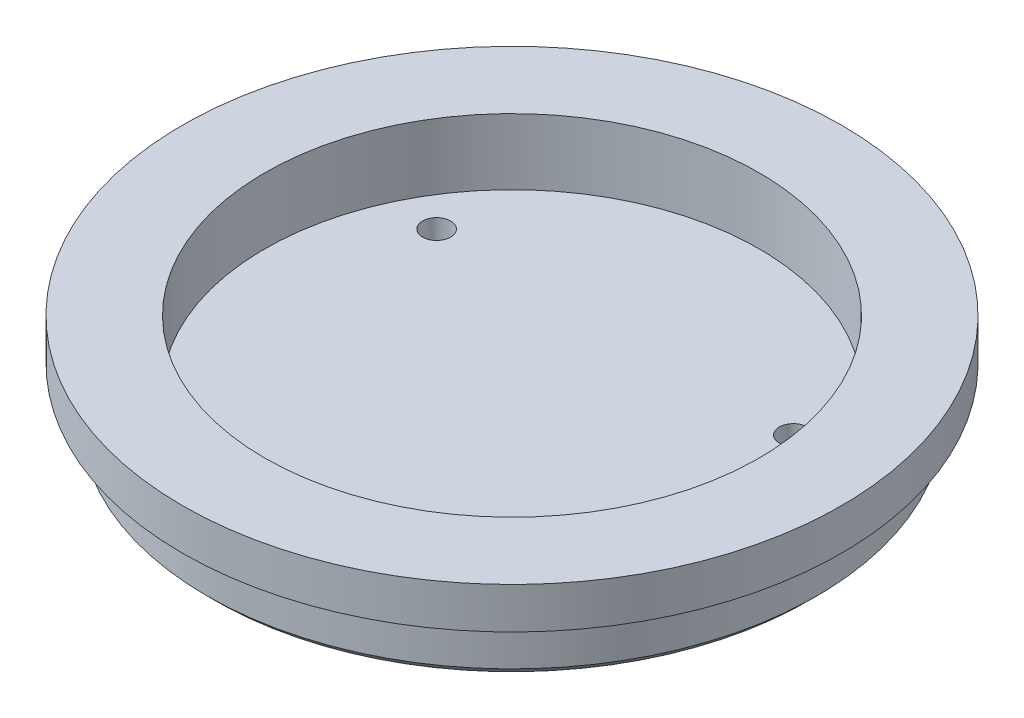
ISO-10303-21;
HEADER;
FILE_DESCRIPTION(('STEP AP214'),'2;1');
FILE_NAME('part.step','',(''),(''),'','','');
FILE_SCHEMA(('AUTOMOTIVE_DESIGN { 1 0 10303 214 1 1 1 1 }'));
ENDSEC;
DATA;
#1=APPLICATION_CONTEXT('core data for automotive mechanical design processes');
#2=APPLICATION_PROTOCOL_DEFINITION('international standard','automotive_design',2000,#1);
#3=PRODUCT_CONTEXT('',#1,'mechanical');
#4=PRODUCT('Part','Part','',(#3));
#5=PRODUCT_RELATED_PRODUCT_CATEGORY('part','',(#4));
#6=PRODUCT_DEFINITION_FORMATION('','',#4);
#7=PRODUCT_DEFINITION_CONTEXT('part definition',#1,'design');
#8=PRODUCT_DEFINITION('design','',#6,#7);
#9=PRODUCT_DEFINITION_SHAPE('','',#8);
#10=(LENGTH_UNIT() NAMED_UNIT(*) SI_UNIT(.MILLI.,.METRE.));
#11=(NAMED_UNIT(*) PLANE_ANGLE_UNIT() SI_UNIT($,.RADIAN.));
#12=(NAMED_UNIT(*) SI_UNIT($,.STERADIAN.) SOLID_ANGLE_UNIT());
#13=UNCERTAINTY_MEASURE_WITH_UNIT(LENGTH_MEASURE(1.E-05),#10,'distance_accuracy_value','');
#14=(GEOMETRIC_REPRESENTATION_CONTEXT(3) GLOBAL_UNCERTAINTY_ASSIGNED_CONTEXT((#13)) GLOBAL_UNIT_ASSIGNED_CONTEXT((#10,
#11,#12)) REPRESENTATION_CONTEXT('',''));
#15=CARTESIAN_POINT('',(0.,0.,0.));
#16=DIRECTION('',(0.,0.,1.));
#17=DIRECTION('',(1.,0.,0.));
#18=AXIS2_PLACEMENT_3D('',#15,#16,#17);
#19=CARTESIAN_POINT('',(-21.6506350946111,12.,-12.4999999999998));
#20=DIRECTION('',(0.,1.,0.));
#21=DIRECTION('',(0.,0.,1.));
#22=AXIS2_PLACEMENT_3D('',#19,#20,#21);
#23=CYLINDRICAL_SURFACE('',#22,1.69999999999999);
#24=CARTESIAN_POINT('',(-21.6506350946111,0.,-12.4999999999998));
#25=DIRECTION('',(0.,1.,0.));
#26=DIRECTION('',(0.,0.,1.));
#27=AXIS2_PLACEMENT_3D('',#24,#25,#26);
#28=CIRCLE('',#27,1.69999999999999);
#29=CARTESIAN_POINT('',(-21.6506350946111,0.,-10.7999999999998));
#30=VERTEX_POINT('',#29);
#31=EDGE_CURVE('E63',#30,#30,#28,.T.);
#32=ORIENTED_EDGE('',*,*,#31,.F.);
#33=EDGE_LOOP('',(#32));
#34=FACE_BOUND('',#33,.T.);
#35=CARTESIAN_POINT('',(-21.6506350946111,4.,-12.4999999999998));
#36=DIRECTION('',(0.,1.,0.));
#37=DIRECTION('',(0.,0.,1.));
#38=AXIS2_PLACEMENT_3D('',#35,#36,#37);
#39=CIRCLE('',#38,1.69999999999999);
#40=CARTESIAN_POINT('',(-21.6506350946111,4.,-10.7999999999998));
#41=VERTEX_POINT('',#40);
#42=EDGE_CURVE('E72',#41,#41,#39,.F.);
#43=ORIENTED_EDGE('',*,*,#42,.F.);
#44=EDGE_LOOP('',(#43));
#45=FACE_BOUND('',#44,.T.);
#46=ADVANCED_FACE('F34',(#34,#45),#23,.F.);
#47=CARTESIAN_POINT('',(21.6506350946109,12.,-12.5000000000001));
#48=DIRECTION('',(0.,1.,0.));
#49=DIRECTION('',(0.,0.,1.));
#50=AXIS2_PLACEMENT_3D('',#47,#48,#49);
#51=CYLINDRICAL_SURFACE('',#50,1.69999999999999);
#52=CARTESIAN_POINT('',(21.6506350946109,0.,-12.5000000000001));
#53=DIRECTION('',(0.,1.,0.));
#54=DIRECTION('',(0.,0.,1.));
#55=AXIS2_PLACEMENT_3D('',#52,#53,#54);
#56=CIRCLE('',#55,1.69999999999999);
#57=CARTESIAN_POINT('',(21.6506350946109,0.,-10.8000000000001));
#58=VERTEX_POINT('',#57);
#59=EDGE_CURVE('E66',#58,#58,#56,.T.);
#60=ORIENTED_EDGE('',*,*,#59,.F.);
#61=EDGE_LOOP('',(#60));
#62=FACE_BOUND('',#61,.T.);
#63=CARTESIAN_POINT('',(21.6506350946109,4.,-12.5000000000001));
#64=DIRECTION('',(0.,1.,0.));
#65=DIRECTION('',(0.,0.,1.));
#66=AXIS2_PLACEMENT_3D('',#63,#64,#65);
#67=CIRCLE('',#66,1.69999999999999);
#68=CARTESIAN_POINT('',(21.6506350946109,4.,-10.8000000000001));
#69=VERTEX_POINT('',#68);
#70=EDGE_CURVE('E76',#69,#69,#67,.F.);
#71=ORIENTED_EDGE('',*,*,#70,.F.);
#72=EDGE_LOOP('',(#71));
#73=FACE_BOUND('',#72,.T.);
#74=ADVANCED_FACE('F96',(#62,#73),#51,.F.);
#75=CARTESIAN_POINT('',(0.,12.,25.));
#76=DIRECTION('',(0.,1.,0.));
#77=DIRECTION('',(0.,0.,1.));
#78=AXIS2_PLACEMENT_3D('',#75,#76,#77);
#79=CYLINDRICAL_SURFACE('',#78,1.69999999999999);
#80=CARTESIAN_POINT('',(0.,0.,25.));
#81=DIRECTION('',(0.,1.,0.));
#82=DIRECTION('',(0.,0.,1.));
#83=AXIS2_PLACEMENT_3D('',#80,#81,#82);
#84=CIRCLE('',#83,1.69999999999999);
#85=CARTESIAN_POINT('',(0.,0.,26.7));
#86=VERTEX_POINT('',#85);
#87=EDGE_CURVE('E69',#86,#86,#84,.T.);
#88=ORIENTED_EDGE('',*,*,#87,.F.);
#89=EDGE_LOOP('',(#88));
#90=FACE_BOUND('',#89,.T.);
#91=CARTESIAN_POINT('',(0.,4.,25.));
#92=DIRECTION('',(0.,1.,0.));
#93=DIRECTION('',(0.,0.,1.));
#94=AXIS2_PLACEMENT_3D('',#91,#92,#93);
#95=CIRCLE('',#94,1.69999999999999);
#96=CARTESIAN_POINT('',(0.,4.,26.7));
#97=VERTEX_POINT('',#96);
#98=EDGE_CURVE('E38',#97,#97,#95,.F.);
#99=ORIENTED_EDGE('',*,*,#98,.F.);
#100=EDGE_LOOP('',(#99));
#101=FACE_BOUND('',#100,.T.);
#102=ADVANCED_FACE('F93',(#90,#101),#79,.F.);
#103=CARTESIAN_POINT('',(0.,0.,0.));
#104=DIRECTION('',(0.,-1.,0.));
#105=DIRECTION('',(0.,0.,-1.));
#106=AXIS2_PLACEMENT_3D('',#103,#104,#105);
#107=PLANE('',#106);
#108=ORIENTED_EDGE('',*,*,#87,.T.);
#109=EDGE_LOOP('',(#108));
#110=FACE_BOUND('',#109,.T.);
#111=ORIENTED_EDGE('',*,*,#59,.T.);
#112=EDGE_LOOP('',(#111));
#113=FACE_BOUND('',#112,.T.);
#114=ORIENTED_EDGE('',*,*,#31,.T.);
#115=EDGE_LOOP('',(#114));
#116=FACE_BOUND('',#115,.T.);
#117=CARTESIAN_POINT('',(0.,0.,0.));
#118=DIRECTION('',(0.,-1.,0.));
#119=DIRECTION('',(0.,0.,-1.));
#120=AXIS2_PLACEMENT_3D('',#117,#118,#119);
#121=CIRCLE('',#120,36.);
#122=CARTESIAN_POINT('',(0.,0.,-36.));
#123=VERTEX_POINT('',#122);
#124=EDGE_CURVE('E43',#123,#123,#121,.T.);
#125=ORIENTED_EDGE('',*,*,#124,.T.);
#126=EDGE_LOOP('',(#125));
#127=FACE_BOUND('',#126,.T.);
#128=ADVANCED_FACE('F95',(#110,#113,#116,#127),#107,.T.);
#129=CARTESIAN_POINT('',(0.,0.,0.));
#130=DIRECTION('',(0.,-1.,0.));
#131=DIRECTION('',(0.,0.,-1.));
#132=AXIS2_PLACEMENT_3D('',#129,#130,#131);
#133=CYLINDRICAL_SURFACE('',#132,37.);
#134=CARTESIAN_POINT('',(0.,1.,0.));
#135=DIRECTION('',(0.,-1.,0.));
#136=DIRECTION('',(0.,0.,-1.));
#137=AXIS2_PLACEMENT_3D('',#134,#135,#136);
#138=CIRCLE('',#137,37.);
#139=CARTESIAN_POINT('',(0.,1.,-37.));
#140=VERTEX_POINT('',#139);
#141=EDGE_CURVE('E10',#140,#140,#138,.F.);
#142=ORIENTED_EDGE('',*,*,#141,.T.);
#143=EDGE_LOOP('',(#142));
#144=FACE_BOUND('',#143,.T.);
#145=CARTESIAN_POINT('',(0.,7.,0.));
#146=DIRECTION('',(0.,-1.,0.));
#147=DIRECTION('',(0.,0.,-1.));
#148=AXIS2_PLACEMENT_3D('',#145,#146,#147);
#149=CIRCLE('',#148,37.);
#150=CARTESIAN_POINT('',(0.,7.,-37.));
#151=VERTEX_POINT('',#150);
#152=EDGE_CURVE('E49',#151,#151,#149,.T.);
#153=ORIENTED_EDGE('',*,*,#152,.T.);
#154=EDGE_LOOP('',(#153));
#155=FACE_BOUND('',#154,.T.);
#156=ADVANCED_FACE('F103',(#144,#155),#133,.T.);
#157=CARTESIAN_POINT('',(0.,7.,-37.));
#158=DIRECTION('',(0.,-1.,0.));
#159=DIRECTION('',(0.,0.,-1.));
#160=AXIS2_PLACEMENT_3D('',#157,#158,#159);
#161=PLANE('',#160);
#162=CARTESIAN_POINT('',(0.,7.,0.));
#163=DIRECTION('',(0.,-1.,0.));
#164=DIRECTION('',(0.,0.,-1.));
#165=AXIS2_PLACEMENT_3D('',#162,#163,#164);
#166=CIRCLE('',#165,40.);
#167=CARTESIAN_POINT('',(0.,7.,-40.));
#168=VERTEX_POINT('',#167);
#169=EDGE_CURVE('E55',#168,#168,#166,.T.);
#170=ORIENTED_EDGE('',*,*,#169,.T.);
#171=EDGE_LOOP('',(#170));
#172=FACE_BOUND('',#171,.T.);
#173=ORIENTED_EDGE('',*,*,#152,.F.);
#174=EDGE_LOOP('',(#173));
#175=FACE_BOUND('',#174,.T.);
#176=ADVANCED_FACE('F124',(#172,#175),#161,.T.);
#177=CARTESIAN_POINT('',(0.,0.,0.));
#178=DIRECTION('',(0.,-1.,0.));
#179=DIRECTION('',(0.,0.,-1.));
#180=AXIS2_PLACEMENT_3D('',#177,#178,#179);
#181=CYLINDRICAL_SURFACE('',#180,40.);
#182=CARTESIAN_POINT('',(0.,12.,0.));
#183=DIRECTION('',(0.,-1.,0.));
#184=DIRECTION('',(0.,0.,-1.));
#185=AXIS2_PLACEMENT_3D('',#182,#183,#184);
#186=CIRCLE('',#185,40.);
#187=CARTESIAN_POINT('',(0.,12.,-40.));
#188=VERTEX_POINT('',#187);
#189=EDGE_CURVE('E59',#188,#188,#186,.T.);
#190=ORIENTED_EDGE('',*,*,#189,.T.);
#191=EDGE_LOOP('',(#190));
#192=FACE_BOUND('',#191,.T.);
#193=ORIENTED_EDGE('',*,*,#169,.F.);
#194=EDGE_LOOP('',(#193));
#195=FACE_BOUND('',#194,.T.);
#196=ADVANCED_FACE('F120',(#192,#195),#181,.T.);
#197=CARTESIAN_POINT('',(0.,12.,-40.));
#198=DIRECTION('',(0.,1.,0.));
#199=DIRECTION('',(0.,0.,1.));
#200=AXIS2_PLACEMENT_3D('',#197,#198,#199);
#201=PLANE('',#200);
#202=CARTESIAN_POINT('',(0.,12.,0.));
#203=DIRECTION('',(0.,1.,0.));
#204=DIRECTION('',(0.,0.,1.));
#205=AXIS2_PLACEMENT_3D('',#202,#203,#204);
#206=CIRCLE('',#205,30.);
#207=CARTESIAN_POINT('',(0.,12.,30.));
#208=VERTEX_POINT('',#207);
#209=EDGE_CURVE('E79',#208,#208,#206,.T.);
#210=ORIENTED_EDGE('',*,*,#209,.F.);
#211=EDGE_LOOP('',(#210));
#212=FACE_BOUND('',#211,.T.);
#213=ORIENTED_EDGE('',*,*,#189,.F.);
#214=EDGE_LOOP('',(#213));
#215=FACE_BOUND('',#214,.T.);
#216=ADVANCED_FACE('F117',(#212,#215),#201,.T.);
#217=CARTESIAN_POINT('',(0.,0.,0.));
#218=DIRECTION('',(0.,1.,0.));
#219=DIRECTION('',(0.,0.,1.));
#220=AXIS2_PLACEMENT_3D('',#217,#218,#219);
#221=CONICAL_SURFACE('',#220,36.,0.785398163397445);
#222=ORIENTED_EDGE('',*,*,#141,.F.);
#223=EDGE_LOOP('',(#222));
#224=FACE_BOUND('',#223,.T.);
#225=ORIENTED_EDGE('',*,*,#124,.F.);
#226=EDGE_LOOP('',(#225));
#227=FACE_BOUND('',#226,.T.);
#228=ADVANCED_FACE('F36',(#224,#227),#221,.T.);
#229=CARTESIAN_POINT('',(0.,4.,0.));
#230=DIRECTION('',(0.,1.,0.));
#231=DIRECTION('',(0.,0.,1.));
#232=AXIS2_PLACEMENT_3D('',#229,#230,#231);
#233=PLANE('',#232);
#234=ORIENTED_EDGE('',*,*,#70,.T.);
#235=EDGE_LOOP('',(#234));
#236=FACE_BOUND('',#235,.T.);
#237=CARTESIAN_POINT('',(0.,4.,0.));
#238=DIRECTION('',(0.,1.,0.));
#239=DIRECTION('',(0.,0.,1.));
#240=AXIS2_PLACEMENT_3D('',#237,#238,#239);
#241=CIRCLE('',#240,30.);
#242=CARTESIAN_POINT('',(0.,4.,30.));
#243=VERTEX_POINT('',#242);
#244=EDGE_CURVE('E82',#243,#243,#241,.T.);
#245=ORIENTED_EDGE('',*,*,#244,.T.);
#246=EDGE_LOOP('',(#245));
#247=FACE_BOUND('',#246,.T.);
#248=ORIENTED_EDGE('',*,*,#98,.T.);
#249=EDGE_LOOP('',(#248));
#250=FACE_BOUND('',#249,.T.);
#251=ORIENTED_EDGE('',*,*,#42,.T.);
#252=EDGE_LOOP('',(#251));
#253=FACE_BOUND('',#252,.T.);
#254=ADVANCED_FACE('F90',(#236,#247,#250,#253),#233,.T.);
#255=CARTESIAN_POINT('',(0.,4.,0.));
#256=DIRECTION('',(0.,1.,0.));
#257=DIRECTION('',(0.,0.,1.));
#258=AXIS2_PLACEMENT_3D('',#255,#256,#257);
#259=CYLINDRICAL_SURFACE('',#258,30.);
#260=ORIENTED_EDGE('',*,*,#244,.F.);
#261=EDGE_LOOP('',(#260));
#262=FACE_BOUND('',#261,.T.);
#263=ORIENTED_EDGE('',*,*,#209,.T.);
#264=EDGE_LOOP('',(#263));
#265=FACE_BOUND('',#264,.T.);
#266=ADVANCED_FACE('F161',(#262,#265),#259,.F.);
#267=CLOSED_SHELL('',(#46,#74,#102,#128,#156,#176,#196,#216,#228,#254,#266));
#268=MANIFOLD_SOLID_BREP('B2',#267);
#269=ADVANCED_BREP_SHAPE_REPRESENTATION('',(#18,#268),#14);
#270=SHAPE_DEFINITION_REPRESENTATION(#9,#269);
ENDSEC;
END-ISO-10303-21;
